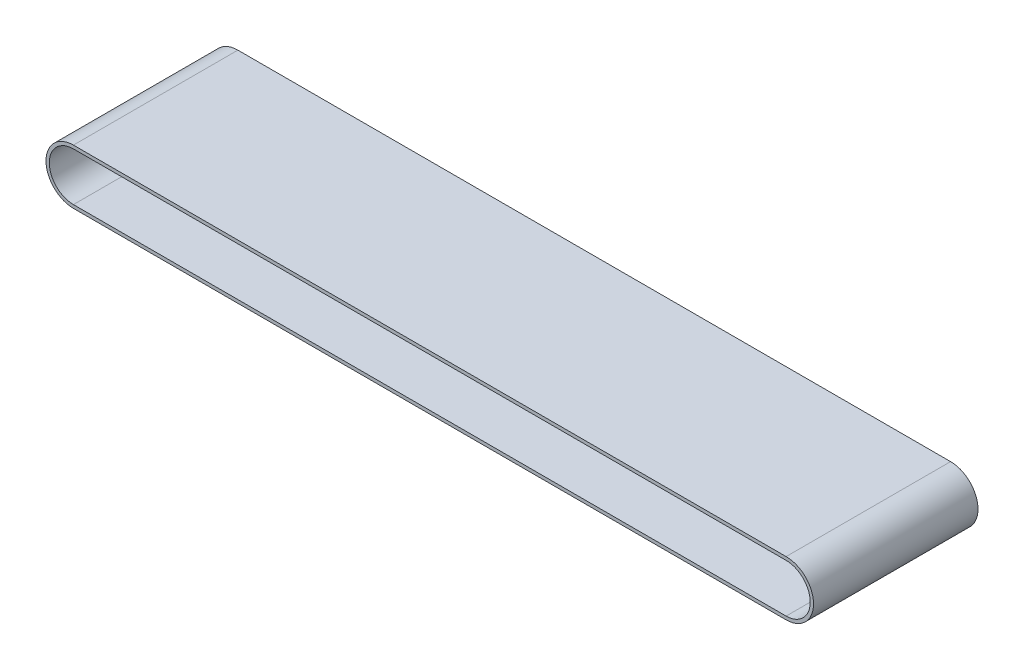
ISO-10303-21;
HEADER;
FILE_DESCRIPTION(('STEP AP214'),'2;1');
FILE_NAME('part.step','',(''),(''),'','','');
FILE_SCHEMA(('AUTOMOTIVE_DESIGN { 1 0 10303 214 1 1 1 1 }'));
ENDSEC;
DATA;
#1=APPLICATION_CONTEXT('core data for automotive mechanical design processes');
#2=APPLICATION_PROTOCOL_DEFINITION('international standard','automotive_design',2000,#1);
#3=PRODUCT_CONTEXT('',#1,'mechanical');
#4=PRODUCT('Part','Part','',(#3));
#5=PRODUCT_RELATED_PRODUCT_CATEGORY('part','',(#4));
#6=PRODUCT_DEFINITION_FORMATION('','',#4);
#7=PRODUCT_DEFINITION_CONTEXT('part definition',#1,'design');
#8=PRODUCT_DEFINITION('design','',#6,#7);
#9=PRODUCT_DEFINITION_SHAPE('','',#8);
#10=(LENGTH_UNIT() NAMED_UNIT(*) SI_UNIT(.MILLI.,.METRE.));
#11=(NAMED_UNIT(*) PLANE_ANGLE_UNIT() SI_UNIT($,.RADIAN.));
#12=(NAMED_UNIT(*) SI_UNIT($,.STERADIAN.) SOLID_ANGLE_UNIT());
#13=UNCERTAINTY_MEASURE_WITH_UNIT(LENGTH_MEASURE(1.E-05),#10,'distance_accuracy_value','');
#14=(GEOMETRIC_REPRESENTATION_CONTEXT(3) GLOBAL_UNCERTAINTY_ASSIGNED_CONTEXT((#13)) GLOBAL_UNIT_ASSIGNED_CONTEXT((#10,
#11,#12)) REPRESENTATION_CONTEXT('',''));
#15=CARTESIAN_POINT('',(0.,0.,0.));
#16=DIRECTION('',(0.,0.,1.));
#17=DIRECTION('',(1.,0.,0.));
#18=AXIS2_PLACEMENT_3D('',#15,#16,#17);
#19=CARTESIAN_POINT('',(0.,-50.,150.));
#20=DIRECTION('',(0.,1.,0.));
#21=DIRECTION('',(0.,0.,1.));
#22=AXIS2_PLACEMENT_3D('',#19,#20,#21);
#23=PLANE('',#22);
#24=DIRECTION('',(1.,0.,0.));
#25=VECTOR('',#24,1.);
#26=CARTESIAN_POINT('',(0.,-50.,-150.));
#27=LINE('',#26,#25);
#28=CARTESIAN_POINT('',(0.,-50.,-150.));
#29=VERTEX_POINT('',#28);
#30=CARTESIAN_POINT('',(1300.,-50.,-150.));
#31=VERTEX_POINT('',#30);
#32=EDGE_CURVE('E149',#29,#31,#27,.T.);
#33=ORIENTED_EDGE('',*,*,#32,.T.);
#34=DIRECTION('',(0.,0.,-1.));
#35=VECTOR('',#34,1.);
#36=CARTESIAN_POINT('',(1300.,-50.,150.));
#37=LINE('',#36,#35);
#38=CARTESIAN_POINT('',(1300.,-50.,150.));
#39=VERTEX_POINT('',#38);
#40=EDGE_CURVE('E11',#39,#31,#37,.T.);
#41=ORIENTED_EDGE('',*,*,#40,.F.);
#42=DIRECTION('',(1.,0.,0.));
#43=VECTOR('',#42,1.);
#44=CARTESIAN_POINT('',(0.,-50.,150.));
#45=LINE('',#44,#43);
#46=CARTESIAN_POINT('',(0.,-50.,150.));
#47=VERTEX_POINT('',#46);
#48=EDGE_CURVE('E120',#47,#39,#45,.T.);
#49=ORIENTED_EDGE('',*,*,#48,.F.);
#50=DIRECTION('',(0.,0.,-1.));
#51=VECTOR('',#50,1.);
#52=CARTESIAN_POINT('',(0.,-50.,150.));
#53=LINE('',#52,#51);
#54=EDGE_CURVE('E157',#47,#29,#53,.T.);
#55=ORIENTED_EDGE('',*,*,#54,.T.);
#56=EDGE_LOOP('',(#33,#41,#49,#55));
#57=FACE_BOUND('',#56,.T.);
#58=ADVANCED_FACE('F43',(#57),#23,.F.);
#59=CARTESIAN_POINT('',(1300.,0.,150.));
#60=DIRECTION('',(0.,0.,-1.));
#61=DIRECTION('',(-1.,0.,0.));
#62=AXIS2_PLACEMENT_3D('',#59,#60,#61);
#63=CYLINDRICAL_SURFACE('',#62,50.);
#64=CARTESIAN_POINT('',(1300.,0.,-150.));
#65=DIRECTION('',(0.,0.,1.));
#66=DIRECTION('',(1.,0.,0.));
#67=AXIS2_PLACEMENT_3D('',#64,#65,#66);
#68=CIRCLE('',#67,50.);
#69=CARTESIAN_POINT('',(1300.,50.,-150.));
#70=VERTEX_POINT('',#69);
#71=EDGE_CURVE('E126',#31,#70,#68,.T.);
#72=ORIENTED_EDGE('',*,*,#71,.T.);
#73=DIRECTION('',(0.,0.,-1.));
#74=VECTOR('',#73,1.);
#75=CARTESIAN_POINT('',(1300.,50.,150.));
#76=LINE('',#75,#74);
#77=CARTESIAN_POINT('',(1300.,50.,150.));
#78=VERTEX_POINT('',#77);
#79=EDGE_CURVE('E53',#78,#70,#76,.T.);
#80=ORIENTED_EDGE('',*,*,#79,.F.);
#81=CARTESIAN_POINT('',(1300.,0.,150.));
#82=DIRECTION('',(0.,0.,1.));
#83=DIRECTION('',(1.,0.,0.));
#84=AXIS2_PLACEMENT_3D('',#81,#82,#83);
#85=CIRCLE('',#84,50.);
#86=EDGE_CURVE('E114',#39,#78,#85,.T.);
#87=ORIENTED_EDGE('',*,*,#86,.F.);
#88=ORIENTED_EDGE('',*,*,#40,.T.);
#89=EDGE_LOOP('',(#72,#80,#87,#88));
#90=FACE_BOUND('',#89,.T.);
#91=ADVANCED_FACE('F125',(#90),#63,.T.);
#92=CARTESIAN_POINT('',(0.,50.,150.));
#93=DIRECTION('',(0.,1.,0.));
#94=DIRECTION('',(0.,0.,1.));
#95=AXIS2_PLACEMENT_3D('',#92,#93,#94);
#96=PLANE('',#95);
#97=DIRECTION('',(1.,0.,0.));
#98=VECTOR('',#97,1.);
#99=CARTESIAN_POINT('',(0.,50.,-150.));
#100=LINE('',#99,#98);
#101=CARTESIAN_POINT('',(0.,50.,-150.));
#102=VERTEX_POINT('',#101);
#103=EDGE_CURVE('E153',#102,#70,#100,.T.);
#104=ORIENTED_EDGE('',*,*,#103,.F.);
#105=DIRECTION('',(0.,0.,-1.));
#106=VECTOR('',#105,1.);
#107=CARTESIAN_POINT('',(0.,50.,150.));
#108=LINE('',#107,#106);
#109=CARTESIAN_POINT('',(0.,50.,150.));
#110=VERTEX_POINT('',#109);
#111=EDGE_CURVE('E90',#110,#102,#108,.T.);
#112=ORIENTED_EDGE('',*,*,#111,.F.);
#113=DIRECTION('',(1.,0.,0.));
#114=VECTOR('',#113,1.);
#115=CARTESIAN_POINT('',(0.,50.,150.));
#116=LINE('',#115,#114);
#117=EDGE_CURVE('E118',#110,#78,#116,.T.);
#118=ORIENTED_EDGE('',*,*,#117,.T.);
#119=ORIENTED_EDGE('',*,*,#79,.T.);
#120=EDGE_LOOP('',(#104,#112,#118,#119));
#121=FACE_BOUND('',#120,.T.);
#122=ADVANCED_FACE('F131',(#121),#96,.T.);
#123=CARTESIAN_POINT('',(0.,0.,150.));
#124=DIRECTION('',(0.,0.,-1.));
#125=DIRECTION('',(-1.,0.,0.));
#126=AXIS2_PLACEMENT_3D('',#123,#124,#125);
#127=CYLINDRICAL_SURFACE('',#126,44.);
#128=CARTESIAN_POINT('',(0.,0.,-150.));
#129=DIRECTION('',(0.,0.,1.));
#130=DIRECTION('',(1.,0.,0.));
#131=AXIS2_PLACEMENT_3D('',#128,#129,#130);
#132=CIRCLE('',#131,44.);
#133=CARTESIAN_POINT('',(0.,44.,-150.));
#134=VERTEX_POINT('',#133);
#135=CARTESIAN_POINT('',(0.,-44.,-150.));
#136=VERTEX_POINT('',#135);
#137=EDGE_CURVE('E137',#134,#136,#132,.T.);
#138=ORIENTED_EDGE('',*,*,#137,.F.);
#139=DIRECTION('',(0.,0.,-1.));
#140=VECTOR('',#139,1.);
#141=CARTESIAN_POINT('',(0.,44.,150.));
#142=LINE('',#141,#140);
#143=CARTESIAN_POINT('',(0.,44.,150.));
#144=VERTEX_POINT('',#143);
#145=EDGE_CURVE('E47',#144,#134,#142,.T.);
#146=ORIENTED_EDGE('',*,*,#145,.F.);
#147=CARTESIAN_POINT('',(0.,0.,150.));
#148=DIRECTION('',(0.,0.,1.));
#149=DIRECTION('',(1.,0.,0.));
#150=AXIS2_PLACEMENT_3D('',#147,#148,#149);
#151=CIRCLE('',#150,44.);
#152=CARTESIAN_POINT('',(0.,-44.,150.));
#153=VERTEX_POINT('',#152);
#154=EDGE_CURVE('E156',#144,#153,#151,.T.);
#155=ORIENTED_EDGE('',*,*,#154,.T.);
#156=DIRECTION('',(0.,0.,-1.));
#157=VECTOR('',#156,1.);
#158=CARTESIAN_POINT('',(0.,-44.,150.));
#159=LINE('',#158,#157);
#160=EDGE_CURVE('E133',#153,#136,#159,.T.);
#161=ORIENTED_EDGE('',*,*,#160,.T.);
#162=EDGE_LOOP('',(#138,#146,#155,#161));
#163=FACE_BOUND('',#162,.T.);
#164=ADVANCED_FACE('F45',(#163),#127,.F.);
#165=CARTESIAN_POINT('',(0.,44.,150.));
#166=DIRECTION('',(0.,1.,0.));
#167=DIRECTION('',(-1.,0.,0.));
#168=AXIS2_PLACEMENT_3D('',#165,#166,#167);
#169=PLANE('',#168);
#170=DIRECTION('',(1.,0.,0.));
#171=VECTOR('',#170,1.);
#172=CARTESIAN_POINT('',(0.,44.,-150.));
#173=LINE('',#172,#171);
#174=CARTESIAN_POINT('',(1300.,44.,-150.));
#175=VERTEX_POINT('',#174);
#176=EDGE_CURVE('E140',#134,#175,#173,.T.);
#177=ORIENTED_EDGE('',*,*,#176,.T.);
#178=DIRECTION('',(0.,0.,-1.));
#179=VECTOR('',#178,1.);
#180=CARTESIAN_POINT('',(1300.,44.,150.));
#181=LINE('',#180,#179);
#182=CARTESIAN_POINT('',(1300.,44.,150.));
#183=VERTEX_POINT('',#182);
#184=EDGE_CURVE('E162',#183,#175,#181,.T.);
#185=ORIENTED_EDGE('',*,*,#184,.F.);
#186=DIRECTION('',(1.,0.,0.));
#187=VECTOR('',#186,1.);
#188=CARTESIAN_POINT('',(0.,44.,150.));
#189=LINE('',#188,#187);
#190=EDGE_CURVE('E170',#144,#183,#189,.T.);
#191=ORIENTED_EDGE('',*,*,#190,.F.);
#192=ORIENTED_EDGE('',*,*,#145,.T.);
#193=EDGE_LOOP('',(#177,#185,#191,#192));
#194=FACE_BOUND('',#193,.T.);
#195=ADVANCED_FACE('F169',(#194),#169,.F.);
#196=CARTESIAN_POINT('',(1300.,0.,150.));
#197=DIRECTION('',(0.,0.,-1.));
#198=DIRECTION('',(-1.,0.,0.));
#199=AXIS2_PLACEMENT_3D('',#196,#197,#198);
#200=CYLINDRICAL_SURFACE('',#199,44.);
#201=CARTESIAN_POINT('',(1300.,0.,-150.));
#202=DIRECTION('',(0.,0.,1.));
#203=DIRECTION('',(1.,0.,0.));
#204=AXIS2_PLACEMENT_3D('',#201,#202,#203);
#205=CIRCLE('',#204,44.);
#206=CARTESIAN_POINT('',(1300.,-44.,-150.));
#207=VERTEX_POINT('',#206);
#208=EDGE_CURVE('E143',#207,#175,#205,.T.);
#209=ORIENTED_EDGE('',*,*,#208,.F.);
#210=DIRECTION('',(0.,0.,-1.));
#211=VECTOR('',#210,1.);
#212=CARTESIAN_POINT('',(1300.,-44.,150.));
#213=LINE('',#212,#211);
#214=CARTESIAN_POINT('',(1300.,-44.,150.));
#215=VERTEX_POINT('',#214);
#216=EDGE_CURVE('E161',#215,#207,#213,.T.);
#217=ORIENTED_EDGE('',*,*,#216,.F.);
#218=CARTESIAN_POINT('',(1300.,0.,150.));
#219=DIRECTION('',(0.,0.,1.));
#220=DIRECTION('',(1.,0.,0.));
#221=AXIS2_PLACEMENT_3D('',#218,#219,#220);
#222=CIRCLE('',#221,44.);
#223=EDGE_CURVE('E210',#215,#183,#222,.T.);
#224=ORIENTED_EDGE('',*,*,#223,.T.);
#225=ORIENTED_EDGE('',*,*,#184,.T.);
#226=EDGE_LOOP('',(#209,#217,#224,#225));
#227=FACE_BOUND('',#226,.T.);
#228=ADVANCED_FACE('F182',(#227),#200,.F.);
#229=CARTESIAN_POINT('',(0.,-44.,150.));
#230=DIRECTION('',(0.,1.,0.));
#231=DIRECTION('',(-1.,0.,0.));
#232=AXIS2_PLACEMENT_3D('',#229,#230,#231);
#233=PLANE('',#232);
#234=DIRECTION('',(1.,0.,0.));
#235=VECTOR('',#234,1.);
#236=CARTESIAN_POINT('',(0.,-44.,-150.));
#237=LINE('',#236,#235);
#238=EDGE_CURVE('E146',#136,#207,#237,.T.);
#239=ORIENTED_EDGE('',*,*,#238,.F.);
#240=ORIENTED_EDGE('',*,*,#160,.F.);
#241=DIRECTION('',(1.,0.,0.));
#242=VECTOR('',#241,1.);
#243=CARTESIAN_POINT('',(0.,-44.,150.));
#244=LINE('',#243,#242);
#245=EDGE_CURVE('E180',#153,#215,#244,.T.);
#246=ORIENTED_EDGE('',*,*,#245,.T.);
#247=ORIENTED_EDGE('',*,*,#216,.T.);
#248=EDGE_LOOP('',(#239,#240,#246,#247));
#249=FACE_BOUND('',#248,.T.);
#250=ADVANCED_FACE('F179',(#249),#233,.T.);
#251=CARTESIAN_POINT('',(0.,0.,150.));
#252=DIRECTION('',(0.,0.,-1.));
#253=DIRECTION('',(-1.,0.,0.));
#254=AXIS2_PLACEMENT_3D('',#251,#252,#253);
#255=CYLINDRICAL_SURFACE('',#254,50.);
#256=CARTESIAN_POINT('',(0.,0.,-150.));
#257=DIRECTION('',(0.,0.,1.));
#258=DIRECTION('',(1.,0.,0.));
#259=AXIS2_PLACEMENT_3D('',#256,#257,#258);
#260=CIRCLE('',#259,50.);
#261=EDGE_CURVE('E93',#102,#29,#260,.T.);
#262=ORIENTED_EDGE('',*,*,#261,.T.);
#263=ORIENTED_EDGE('',*,*,#54,.F.);
#264=CARTESIAN_POINT('',(0.,0.,150.));
#265=DIRECTION('',(0.,0.,1.));
#266=DIRECTION('',(1.,0.,0.));
#267=AXIS2_PLACEMENT_3D('',#264,#265,#266);
#268=CIRCLE('',#267,50.);
#269=EDGE_CURVE('E62',#110,#47,#268,.T.);
#270=ORIENTED_EDGE('',*,*,#269,.F.);
#271=ORIENTED_EDGE('',*,*,#111,.T.);
#272=EDGE_LOOP('',(#262,#263,#270,#271));
#273=FACE_BOUND('',#272,.T.);
#274=ADVANCED_FACE('F189',(#273),#255,.T.);
#275=CARTESIAN_POINT('',(0.,0.,150.));
#276=DIRECTION('',(0.,0.,1.));
#277=DIRECTION('',(1.,0.,0.));
#278=AXIS2_PLACEMENT_3D('',#275,#276,#277);
#279=PLANE('',#278);
#280=ORIENTED_EDGE('',*,*,#154,.F.);
#281=ORIENTED_EDGE('',*,*,#190,.T.);
#282=ORIENTED_EDGE('',*,*,#223,.F.);
#283=ORIENTED_EDGE('',*,*,#245,.F.);
#284=EDGE_LOOP('',(#280,#281,#282,#283));
#285=FACE_BOUND('',#284,.T.);
#286=ORIENTED_EDGE('',*,*,#48,.T.);
#287=ORIENTED_EDGE('',*,*,#86,.T.);
#288=ORIENTED_EDGE('',*,*,#117,.F.);
#289=ORIENTED_EDGE('',*,*,#269,.T.);
#290=EDGE_LOOP('',(#286,#287,#288,#289));
#291=FACE_BOUND('',#290,.T.);
#292=ADVANCED_FACE('F116',(#285,#291),#279,.T.);
#293=CARTESIAN_POINT('',(0.,0.,-150.));
#294=DIRECTION('',(0.,0.,1.));
#295=DIRECTION('',(1.,0.,0.));
#296=AXIS2_PLACEMENT_3D('',#293,#294,#295);
#297=PLANE('',#296);
#298=ORIENTED_EDGE('',*,*,#137,.T.);
#299=ORIENTED_EDGE('',*,*,#238,.T.);
#300=ORIENTED_EDGE('',*,*,#208,.T.);
#301=ORIENTED_EDGE('',*,*,#176,.F.);
#302=EDGE_LOOP('',(#298,#299,#300,#301));
#303=FACE_BOUND('',#302,.T.);
#304=ORIENTED_EDGE('',*,*,#32,.F.);
#305=ORIENTED_EDGE('',*,*,#261,.F.);
#306=ORIENTED_EDGE('',*,*,#103,.T.);
#307=ORIENTED_EDGE('',*,*,#71,.F.);
#308=EDGE_LOOP('',(#304,#305,#306,#307));
#309=FACE_BOUND('',#308,.T.);
#310=ADVANCED_FACE('F173',(#303,#309),#297,.F.);
#311=CLOSED_SHELL('',(#58,#91,#122,#164,#195,#228,#250,#274,#292,#310));
#312=MANIFOLD_SOLID_BREP('B2',#311);
#313=ADVANCED_BREP_SHAPE_REPRESENTATION('',(#18,#312),#14);
#314=SHAPE_DEFINITION_REPRESENTATION(#9,#313);
ENDSEC;
END-ISO-10303-21;
